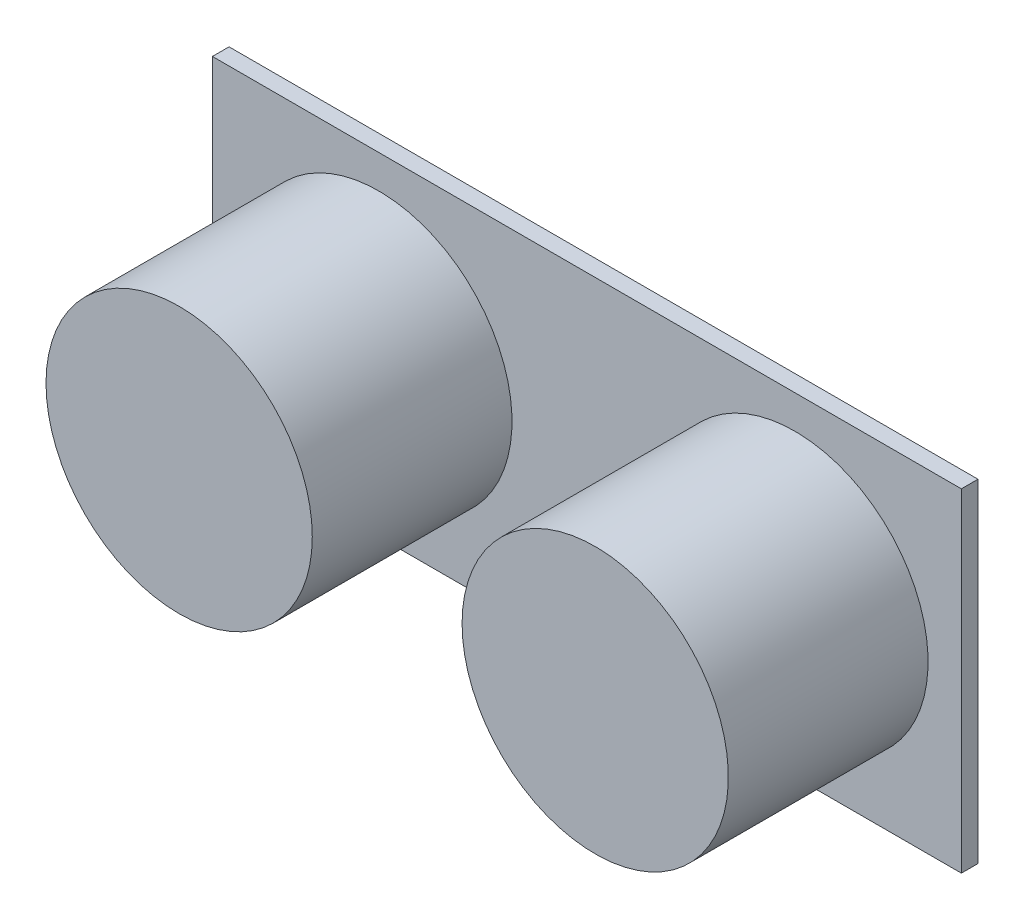
ISO-10303-21;
HEADER;
FILE_DESCRIPTION(('STEP AP214'),'2;1');
FILE_NAME('part.step','',(''),(''),'','','');
FILE_SCHEMA(('AUTOMOTIVE_DESIGN { 1 0 10303 214 1 1 1 1 }'));
ENDSEC;
DATA;
#1=APPLICATION_CONTEXT('core data for automotive mechanical design processes');
#2=APPLICATION_PROTOCOL_DEFINITION('international standard','automotive_design',2000,#1);
#3=PRODUCT_CONTEXT('',#1,'mechanical');
#4=PRODUCT('Part','Part','',(#3));
#5=PRODUCT_RELATED_PRODUCT_CATEGORY('part','',(#4));
#6=PRODUCT_DEFINITION_FORMATION('','',#4);
#7=PRODUCT_DEFINITION_CONTEXT('part definition',#1,'design');
#8=PRODUCT_DEFINITION('design','',#6,#7);
#9=PRODUCT_DEFINITION_SHAPE('','',#8);
#10=(LENGTH_UNIT() NAMED_UNIT(*) SI_UNIT(.MILLI.,.METRE.));
#11=(NAMED_UNIT(*) PLANE_ANGLE_UNIT() SI_UNIT($,.RADIAN.));
#12=(NAMED_UNIT(*) SI_UNIT($,.STERADIAN.) SOLID_ANGLE_UNIT());
#13=UNCERTAINTY_MEASURE_WITH_UNIT(LENGTH_MEASURE(1.E-05),#10,'distance_accuracy_value','');
#14=(GEOMETRIC_REPRESENTATION_CONTEXT(3) GLOBAL_UNCERTAINTY_ASSIGNED_CONTEXT((#13)) GLOBAL_UNIT_ASSIGNED_CONTEXT((#10,
#11,#12)) REPRESENTATION_CONTEXT('',''));
#15=CARTESIAN_POINT('',(0.,0.,0.));
#16=DIRECTION('',(0.,0.,1.));
#17=DIRECTION('',(1.,0.,0.));
#18=AXIS2_PLACEMENT_3D('',#15,#16,#17);
#19=CARTESIAN_POINT('',(22.5,-10.,1.));
#20=DIRECTION('',(-1.,0.,0.));
#21=DIRECTION('',(0.,0.,1.));
#22=AXIS2_PLACEMENT_3D('',#19,#20,#21);
#23=PLANE('',#22);
#24=DIRECTION('',(0.,1.,0.));
#25=VECTOR('',#24,1.);
#26=CARTESIAN_POINT('',(22.5,-10.,0.));
#27=LINE('',#26,#25);
#28=CARTESIAN_POINT('',(22.5,-10.,0.));
#29=VERTEX_POINT('',#28);
#30=CARTESIAN_POINT('',(22.5,10.,0.));
#31=VERTEX_POINT('',#30);
#32=EDGE_CURVE('E99',#29,#31,#27,.T.);
#33=ORIENTED_EDGE('',*,*,#32,.T.);
#34=DIRECTION('',(0.,0.,-1.));
#35=VECTOR('',#34,1.);
#36=CARTESIAN_POINT('',(22.5,10.,1.));
#37=LINE('',#36,#35);
#38=CARTESIAN_POINT('',(22.5,10.,1.));
#39=VERTEX_POINT('',#38);
#40=EDGE_CURVE('E41',#39,#31,#37,.T.);
#41=ORIENTED_EDGE('',*,*,#40,.F.);
#42=DIRECTION('',(0.,1.,0.));
#43=VECTOR('',#42,1.);
#44=CARTESIAN_POINT('',(22.5,-10.,1.));
#45=LINE('',#44,#43);
#46=CARTESIAN_POINT('',(22.5,-10.,1.));
#47=VERTEX_POINT('',#46);
#48=EDGE_CURVE('E85',#47,#39,#45,.T.);
#49=ORIENTED_EDGE('',*,*,#48,.F.);
#50=DIRECTION('',(0.,0.,-1.));
#51=VECTOR('',#50,1.);
#52=CARTESIAN_POINT('',(22.5,-10.,1.));
#53=LINE('',#52,#51);
#54=EDGE_CURVE('E95',#47,#29,#53,.T.);
#55=ORIENTED_EDGE('',*,*,#54,.T.);
#56=EDGE_LOOP('',(#33,#41,#49,#55));
#57=FACE_BOUND('',#56,.T.);
#58=ADVANCED_FACE('F33',(#57),#23,.F.);
#59=CARTESIAN_POINT('',(-22.5,10.,1.));
#60=DIRECTION('',(0.,-1.,0.));
#61=DIRECTION('',(0.,0.,-1.));
#62=AXIS2_PLACEMENT_3D('',#59,#60,#61);
#63=PLANE('',#62);
#64=DIRECTION('',(-1.,0.,0.));
#65=VECTOR('',#64,1.);
#66=CARTESIAN_POINT('',(-22.5,10.,0.));
#67=LINE('',#66,#65);
#68=CARTESIAN_POINT('',(-22.5,10.,0.));
#69=VERTEX_POINT('',#68);
#70=EDGE_CURVE('E90',#31,#69,#67,.T.);
#71=ORIENTED_EDGE('',*,*,#70,.T.);
#72=DIRECTION('',(0.,0.,-1.));
#73=VECTOR('',#72,1.);
#74=CARTESIAN_POINT('',(-22.5,10.,1.));
#75=LINE('',#74,#73);
#76=CARTESIAN_POINT('',(-22.5,10.,1.));
#77=VERTEX_POINT('',#76);
#78=EDGE_CURVE('E88',#77,#69,#75,.T.);
#79=ORIENTED_EDGE('',*,*,#78,.F.);
#80=DIRECTION('',(-1.,0.,0.));
#81=VECTOR('',#80,1.);
#82=CARTESIAN_POINT('',(-22.5,10.,1.));
#83=LINE('',#82,#81);
#84=EDGE_CURVE('E80',#39,#77,#83,.T.);
#85=ORIENTED_EDGE('',*,*,#84,.F.);
#86=ORIENTED_EDGE('',*,*,#40,.T.);
#87=EDGE_LOOP('',(#71,#79,#85,#86));
#88=FACE_BOUND('',#87,.T.);
#89=ADVANCED_FACE('F89',(#88),#63,.F.);
#90=CARTESIAN_POINT('',(-22.5,-10.,1.));
#91=DIRECTION('',(1.,0.,0.));
#92=DIRECTION('',(0.,0.,-1.));
#93=AXIS2_PLACEMENT_3D('',#90,#91,#92);
#94=PLANE('',#93);
#95=DIRECTION('',(0.,-1.,0.));
#96=VECTOR('',#95,1.);
#97=CARTESIAN_POINT('',(-22.5,-10.,0.));
#98=LINE('',#97,#96);
#99=CARTESIAN_POINT('',(-22.5,-10.,0.));
#100=VERTEX_POINT('',#99);
#101=EDGE_CURVE('E66',#69,#100,#98,.T.);
#102=ORIENTED_EDGE('',*,*,#101,.T.);
#103=DIRECTION('',(0.,0.,-1.));
#104=VECTOR('',#103,1.);
#105=CARTESIAN_POINT('',(-22.5,-10.,1.));
#106=LINE('',#105,#104);
#107=CARTESIAN_POINT('',(-22.5,-10.,1.));
#108=VERTEX_POINT('',#107);
#109=EDGE_CURVE('E91',#108,#100,#106,.T.);
#110=ORIENTED_EDGE('',*,*,#109,.F.);
#111=DIRECTION('',(0.,-1.,0.));
#112=VECTOR('',#111,1.);
#113=CARTESIAN_POINT('',(-22.5,-10.,1.));
#114=LINE('',#113,#112);
#115=EDGE_CURVE('E83',#77,#108,#114,.T.);
#116=ORIENTED_EDGE('',*,*,#115,.F.);
#117=ORIENTED_EDGE('',*,*,#78,.T.);
#118=EDGE_LOOP('',(#102,#110,#116,#117));
#119=FACE_BOUND('',#118,.T.);
#120=ADVANCED_FACE('F93',(#119),#94,.F.);
#121=CARTESIAN_POINT('',(-22.5,-10.,1.));
#122=DIRECTION('',(0.,1.,0.));
#123=DIRECTION('',(0.,0.,1.));
#124=AXIS2_PLACEMENT_3D('',#121,#122,#123);
#125=PLANE('',#124);
#126=DIRECTION('',(1.,0.,0.));
#127=VECTOR('',#126,1.);
#128=CARTESIAN_POINT('',(-22.5,-10.,0.));
#129=LINE('',#128,#127);
#130=EDGE_CURVE('E72',#100,#29,#129,.T.);
#131=ORIENTED_EDGE('',*,*,#130,.T.);
#132=ORIENTED_EDGE('',*,*,#54,.F.);
#133=DIRECTION('',(1.,0.,0.));
#134=VECTOR('',#133,1.);
#135=CARTESIAN_POINT('',(-22.5,-10.,1.));
#136=LINE('',#135,#134);
#137=EDGE_CURVE('E49',#108,#47,#136,.T.);
#138=ORIENTED_EDGE('',*,*,#137,.F.);
#139=ORIENTED_EDGE('',*,*,#109,.T.);
#140=EDGE_LOOP('',(#131,#132,#138,#139));
#141=FACE_BOUND('',#140,.T.);
#142=ADVANCED_FACE('F121',(#141),#125,.F.);
#143=CARTESIAN_POINT('',(0.,0.,1.));
#144=DIRECTION('',(0.,0.,-1.));
#145=DIRECTION('',(-1.,0.,0.));
#146=AXIS2_PLACEMENT_3D('',#143,#144,#145);
#147=PLANE('',#146);
#148=CARTESIAN_POINT('',(12.5,0.,1.));
#149=DIRECTION('',(0.,0.,-1.));
#150=DIRECTION('',(-1.,0.,0.));
#151=AXIS2_PLACEMENT_3D('',#148,#149,#150);
#152=CIRCLE('',#151,8.);
#153=CARTESIAN_POINT('',(4.49999999999999,0.,1.));
#154=VERTEX_POINT('',#153);
#155=EDGE_CURVE('E181',#154,#154,#152,.T.);
#156=ORIENTED_EDGE('',*,*,#155,.T.);
#157=EDGE_LOOP('',(#156));
#158=FACE_BOUND('',#157,.T.);
#159=CARTESIAN_POINT('',(-12.5,0.,1.));
#160=DIRECTION('',(0.,0.,-1.));
#161=DIRECTION('',(-1.,0.,0.));
#162=AXIS2_PLACEMENT_3D('',#159,#160,#161);
#163=CIRCLE('',#162,8.);
#164=CARTESIAN_POINT('',(-20.5,0.,1.));
#165=VERTEX_POINT('',#164);
#166=EDGE_CURVE('E11',#165,#165,#163,.F.);
#167=ORIENTED_EDGE('',*,*,#166,.F.);
#168=EDGE_LOOP('',(#167));
#169=FACE_BOUND('',#168,.T.);
#170=ORIENTED_EDGE('',*,*,#48,.T.);
#171=ORIENTED_EDGE('',*,*,#84,.T.);
#172=ORIENTED_EDGE('',*,*,#115,.T.);
#173=ORIENTED_EDGE('',*,*,#137,.T.);
#174=EDGE_LOOP('',(#170,#171,#172,#173));
#175=FACE_BOUND('',#174,.T.);
#176=ADVANCED_FACE('F81',(#158,#169,#175),#147,.F.);
#177=CARTESIAN_POINT('',(0.,0.,0.));
#178=DIRECTION('',(0.,0.,-1.));
#179=DIRECTION('',(-1.,0.,0.));
#180=AXIS2_PLACEMENT_3D('',#177,#178,#179);
#181=PLANE('',#180);
#182=ORIENTED_EDGE('',*,*,#32,.F.);
#183=ORIENTED_EDGE('',*,*,#130,.F.);
#184=ORIENTED_EDGE('',*,*,#101,.F.);
#185=ORIENTED_EDGE('',*,*,#70,.F.);
#186=EDGE_LOOP('',(#182,#183,#184,#185));
#187=FACE_BOUND('',#186,.T.);
#188=ADVANCED_FACE('F110',(#187),#181,.T.);
#189=CARTESIAN_POINT('',(-12.5,0.,13.));
#190=DIRECTION('',(0.,0.,-1.));
#191=DIRECTION('',(-1.,0.,0.));
#192=AXIS2_PLACEMENT_3D('',#189,#190,#191);
#193=CYLINDRICAL_SURFACE('',#192,8.);
#194=CARTESIAN_POINT('',(-12.5,0.,13.));
#195=DIRECTION('',(0.,0.,1.));
#196=DIRECTION('',(1.,0.,0.));
#197=AXIS2_PLACEMENT_3D('',#194,#195,#196);
#198=CIRCLE('',#197,8.);
#199=CARTESIAN_POINT('',(-4.49999999999999,0.,13.));
#200=VERTEX_POINT('',#199);
#201=EDGE_CURVE('E102',#200,#200,#198,.T.);
#202=ORIENTED_EDGE('',*,*,#201,.F.);
#203=EDGE_LOOP('',(#202));
#204=FACE_BOUND('',#203,.T.);
#205=ORIENTED_EDGE('',*,*,#166,.T.);
#206=EDGE_LOOP('',(#205));
#207=FACE_BOUND('',#206,.T.);
#208=ADVANCED_FACE('F112',(#204,#207),#193,.T.);
#209=CARTESIAN_POINT('',(-12.5,0.,13.));
#210=DIRECTION('',(0.,0.,1.));
#211=DIRECTION('',(1.,0.,0.));
#212=AXIS2_PLACEMENT_3D('',#209,#210,#211);
#213=PLANE('',#212);
#214=ORIENTED_EDGE('',*,*,#201,.T.);
#215=EDGE_LOOP('',(#214));
#216=FACE_BOUND('',#215,.T.);
#217=ADVANCED_FACE('F118',(#216),#213,.T.);
#218=CARTESIAN_POINT('',(12.5,0.,13.));
#219=DIRECTION('',(0.,0.,-1.));
#220=DIRECTION('',(-1.,0.,0.));
#221=AXIS2_PLACEMENT_3D('',#218,#219,#220);
#222=CYLINDRICAL_SURFACE('',#221,8.);
#223=CARTESIAN_POINT('',(12.5,0.,13.));
#224=DIRECTION('',(0.,0.,-1.));
#225=DIRECTION('',(-1.,0.,0.));
#226=AXIS2_PLACEMENT_3D('',#223,#224,#225);
#227=CIRCLE('',#226,8.);
#228=CARTESIAN_POINT('',(4.49999999999999,0.,13.));
#229=VERTEX_POINT('',#228);
#230=EDGE_CURVE('E178',#229,#229,#227,.T.);
#231=ORIENTED_EDGE('',*,*,#230,.T.);
#232=EDGE_LOOP('',(#231));
#233=FACE_BOUND('',#232,.T.);
#234=ORIENTED_EDGE('',*,*,#155,.F.);
#235=EDGE_LOOP('',(#234));
#236=FACE_BOUND('',#235,.T.);
#237=ADVANCED_FACE('F153',(#233,#236),#222,.T.);
#238=CARTESIAN_POINT('',(12.5,0.,13.));
#239=DIRECTION('',(0.,0.,1.));
#240=DIRECTION('',(-1.,0.,0.));
#241=AXIS2_PLACEMENT_3D('',#238,#239,#240);
#242=PLANE('',#241);
#243=ORIENTED_EDGE('',*,*,#230,.F.);
#244=EDGE_LOOP('',(#243));
#245=FACE_BOUND('',#244,.T.);
#246=ADVANCED_FACE('F158',(#245),#242,.T.);
#247=CLOSED_SHELL('',(#58,#89,#120,#142,#176,#188,#208,#217,#237,#246));
#248=MANIFOLD_SOLID_BREP('B2',#247);
#249=ADVANCED_BREP_SHAPE_REPRESENTATION('',(#18,#248),#14);
#250=SHAPE_DEFINITION_REPRESENTATION(#9,#249);
ENDSEC;
END-ISO-10303-21;
